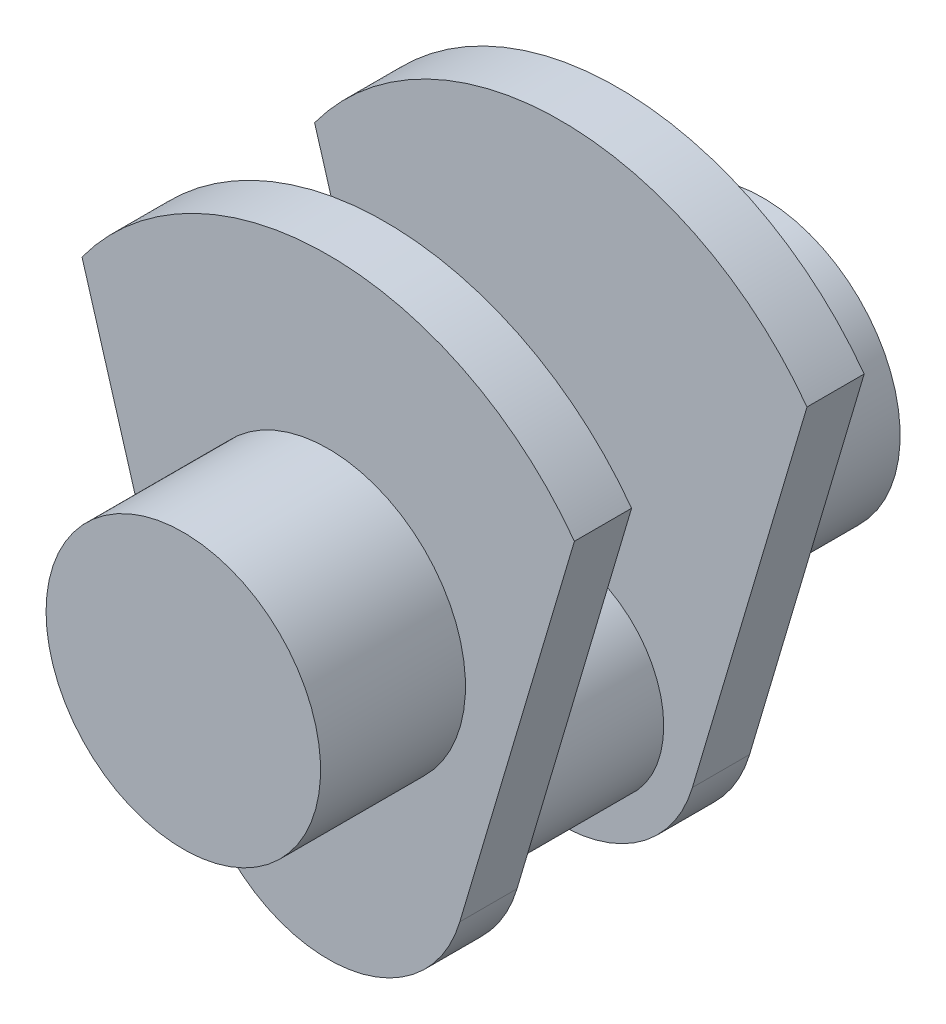
ISO-10303-21;
HEADER;
FILE_DESCRIPTION(('STEP AP214'),'2;1');
FILE_NAME('part.step','',(''),(''),'','','');
FILE_SCHEMA(('AUTOMOTIVE_DESIGN { 1 0 10303 214 1 1 1 1 }'));
ENDSEC;
DATA;
#1=APPLICATION_CONTEXT('core data for automotive mechanical design processes');
#2=APPLICATION_PROTOCOL_DEFINITION('international standard','automotive_design',2000,#1);
#3=PRODUCT_CONTEXT('',#1,'mechanical');
#4=PRODUCT('Part','Part','',(#3));
#5=PRODUCT_RELATED_PRODUCT_CATEGORY('part','',(#4));
#6=PRODUCT_DEFINITION_FORMATION('','',#4);
#7=PRODUCT_DEFINITION_CONTEXT('part definition',#1,'design');
#8=PRODUCT_DEFINITION('design','',#6,#7);
#9=PRODUCT_DEFINITION_SHAPE('','',#8);
#10=(LENGTH_UNIT() NAMED_UNIT(*) SI_UNIT(.MILLI.,.METRE.));
#11=(NAMED_UNIT(*) PLANE_ANGLE_UNIT() SI_UNIT($,.RADIAN.));
#12=(NAMED_UNIT(*) SI_UNIT($,.STERADIAN.) SOLID_ANGLE_UNIT());
#13=UNCERTAINTY_MEASURE_WITH_UNIT(LENGTH_MEASURE(1.E-05),#10,'distance_accuracy_value','');
#14=(GEOMETRIC_REPRESENTATION_CONTEXT(3) GLOBAL_UNCERTAINTY_ASSIGNED_CONTEXT((#13)) GLOBAL_UNIT_ASSIGNED_CONTEXT((#10,
#11,#12)) REPRESENTATION_CONTEXT('',''));
#15=CARTESIAN_POINT('',(0.,0.,0.));
#16=DIRECTION('',(0.,0.,1.));
#17=DIRECTION('',(1.,0.,0.));
#18=AXIS2_PLACEMENT_3D('',#15,#16,#17);
#19=CARTESIAN_POINT('',(0.,0.,15.));
#20=DIRECTION('',(0.,0.,-1.));
#21=DIRECTION('',(-1.,0.,0.));
#22=AXIS2_PLACEMENT_3D('',#19,#20,#21);
#23=CYLINDRICAL_SURFACE('',#22,80.);
#24=CARTESIAN_POINT('',(0.,0.,0.));
#25=DIRECTION('',(0.,0.,1.));
#26=DIRECTION('',(1.,0.,0.));
#27=AXIS2_PLACEMENT_3D('',#24,#25,#26);
#28=CIRCLE('',#27,80.);
#29=CARTESIAN_POINT('',(-64.5698934752721,47.2305923802784,0.));
#30=VERTEX_POINT('',#29);
#31=CARTESIAN_POINT('',(64.5698934752721,47.2305923802784,0.));
#32=VERTEX_POINT('',#31);
#33=EDGE_CURVE('E182',#30,#32,#28,.F.);
#34=ORIENTED_EDGE('',*,*,#33,.F.);
#35=DIRECTION('',(0.,0.,-1.));
#36=VECTOR('',#35,1.);
#37=CARTESIAN_POINT('',(-64.5698934752721,47.2305923802784,15.));
#38=LINE('',#37,#36);
#39=CARTESIAN_POINT('',(-64.5698934752721,47.2305923802784,15.));
#40=VERTEX_POINT('',#39);
#41=EDGE_CURVE('E44',#40,#30,#38,.T.);
#42=ORIENTED_EDGE('',*,*,#41,.F.);
#43=CARTESIAN_POINT('',(0.,0.,15.));
#44=DIRECTION('',(0.,0.,1.));
#45=DIRECTION('',(1.,0.,0.));
#46=AXIS2_PLACEMENT_3D('',#43,#44,#45);
#47=CIRCLE('',#46,80.);
#48=CARTESIAN_POINT('',(64.5698934752721,47.2305923802784,15.));
#49=VERTEX_POINT('',#48);
#50=EDGE_CURVE('E186',#40,#49,#47,.F.);
#51=ORIENTED_EDGE('',*,*,#50,.T.);
#52=DIRECTION('',(0.,0.,-1.));
#53=VECTOR('',#52,1.);
#54=CARTESIAN_POINT('',(64.5698934752721,47.2305923802784,15.));
#55=LINE('',#54,#53);
#56=EDGE_CURVE('E83',#49,#32,#55,.T.);
#57=ORIENTED_EDGE('',*,*,#56,.T.);
#58=EDGE_LOOP('',(#34,#42,#51,#57));
#59=FACE_BOUND('',#58,.T.);
#60=ADVANCED_FACE('F41',(#59),#23,.T.);
#61=CARTESIAN_POINT('',(-46.4995692255856,-13.7737999145419,15.));
#62=DIRECTION('',(-0.958819734868193,-0.284015344703924,0.));
#63=DIRECTION('',(0.284015344703924,-0.958819734868193,0.));
#64=AXIS2_PLACEMENT_3D('',#61,#62,#63);
#65=PLANE('',#64);
#66=DIRECTION('',(-0.284015344703924,0.958819734868193,0.));
#67=VECTOR('',#66,1.);
#68=CARTESIAN_POINT('',(-46.4995692255856,-13.7737999145419,0.));
#69=LINE('',#68,#67);
#70=CARTESIAN_POINT('',(-34.5175104552549,-54.2245524093412,0.));
#71=VERTEX_POINT('',#70);
#72=EDGE_CURVE('E202',#71,#30,#69,.T.);
#73=ORIENTED_EDGE('',*,*,#72,.F.);
#74=DIRECTION('',(0.,0.,-1.));
#75=VECTOR('',#74,1.);
#76=CARTESIAN_POINT('',(-34.5175104552549,-54.2245524093412,15.));
#77=LINE('',#76,#75);
#78=CARTESIAN_POINT('',(-34.5175104552549,-54.2245524093412,15.));
#79=VERTEX_POINT('',#78);
#80=EDGE_CURVE('E214',#79,#71,#77,.T.);
#81=ORIENTED_EDGE('',*,*,#80,.F.);
#82=DIRECTION('',(-0.284015344703924,0.958819734868193,0.));
#83=VECTOR('',#82,1.);
#84=CARTESIAN_POINT('',(-46.4995692255856,-13.7737999145419,15.));
#85=LINE('',#84,#83);
#86=EDGE_CURVE('E189',#79,#40,#85,.T.);
#87=ORIENTED_EDGE('',*,*,#86,.T.);
#88=ORIENTED_EDGE('',*,*,#41,.T.);
#89=EDGE_LOOP('',(#73,#81,#87,#88));
#90=FACE_BOUND('',#89,.T.);
#91=ADVANCED_FACE('F220',(#90),#65,.T.);
#92=CARTESIAN_POINT('',(0.,-44.,15.));
#93=DIRECTION('',(0.,0.,-1.));
#94=DIRECTION('',(-1.,0.,0.));
#95=AXIS2_PLACEMENT_3D('',#92,#93,#94);
#96=CYLINDRICAL_SURFACE('',#95,36.);
#97=CARTESIAN_POINT('',(0.,-44.,0.));
#98=DIRECTION('',(0.,0.,1.));
#99=DIRECTION('',(1.,0.,0.));
#100=AXIS2_PLACEMENT_3D('',#97,#98,#99);
#101=CIRCLE('',#100,36.);
#102=CARTESIAN_POINT('',(34.5175104552549,-54.2245524093412,0.));
#103=VERTEX_POINT('',#102);
#104=EDGE_CURVE('E76',#71,#103,#101,.T.);
#105=ORIENTED_EDGE('',*,*,#104,.T.);
#106=DIRECTION('',(0.,0.,-1.));
#107=VECTOR('',#106,1.);
#108=CARTESIAN_POINT('',(34.5175104552549,-54.2245524093412,15.));
#109=LINE('',#108,#107);
#110=CARTESIAN_POINT('',(34.5175104552549,-54.2245524093412,15.));
#111=VERTEX_POINT('',#110);
#112=EDGE_CURVE('E212',#111,#103,#109,.T.);
#113=ORIENTED_EDGE('',*,*,#112,.F.);
#114=CARTESIAN_POINT('',(0.,-44.,15.));
#115=DIRECTION('',(0.,0.,1.));
#116=DIRECTION('',(1.,0.,0.));
#117=AXIS2_PLACEMENT_3D('',#114,#115,#116);
#118=CIRCLE('',#117,36.);
#119=EDGE_CURVE('E194',#79,#111,#118,.T.);
#120=ORIENTED_EDGE('',*,*,#119,.F.);
#121=ORIENTED_EDGE('',*,*,#80,.T.);
#122=EDGE_LOOP('',(#105,#113,#120,#121));
#123=FACE_BOUND('',#122,.T.);
#124=ADVANCED_FACE('F227',(#123),#96,.T.);
#125=CARTESIAN_POINT('',(46.4995692255856,-13.7737999145419,15.));
#126=DIRECTION('',(-0.958819734868193,0.284015344703923,0.));
#127=DIRECTION('',(-0.284015344703923,-0.958819734868193,0.));
#128=AXIS2_PLACEMENT_3D('',#125,#126,#127);
#129=PLANE('',#128);
#130=DIRECTION('',(0.284015344703923,0.958819734868193,0.));
#131=VECTOR('',#130,1.);
#132=CARTESIAN_POINT('',(46.4995692255856,-13.7737999145419,0.));
#133=LINE('',#132,#131);
#134=EDGE_CURVE('E190',#103,#32,#133,.T.);
#135=ORIENTED_EDGE('',*,*,#134,.T.);
#136=ORIENTED_EDGE('',*,*,#56,.F.);
#137=DIRECTION('',(0.284015344703923,0.958819734868193,0.));
#138=VECTOR('',#137,1.);
#139=CARTESIAN_POINT('',(46.4995692255856,-13.7737999145419,15.));
#140=LINE('',#139,#138);
#141=EDGE_CURVE('E59',#111,#49,#140,.T.);
#142=ORIENTED_EDGE('',*,*,#141,.F.);
#143=ORIENTED_EDGE('',*,*,#112,.T.);
#144=EDGE_LOOP('',(#135,#136,#142,#143));
#145=FACE_BOUND('',#144,.T.);
#146=ADVANCED_FACE('F226',(#145),#129,.F.);
#147=CARTESIAN_POINT('',(0.,0.,15.));
#148=DIRECTION('',(0.,0.,1.));
#149=DIRECTION('',(1.,0.,0.));
#150=AXIS2_PLACEMENT_3D('',#147,#148,#149);
#151=PLANE('',#150);
#152=CARTESIAN_POINT('',(0.,-44.,15.));
#153=DIRECTION('',(0.,0.,1.));
#154=DIRECTION('',(1.,0.,0.));
#155=AXIS2_PLACEMENT_3D('',#152,#153,#154);
#156=CIRCLE('',#155,27.);
#157=CARTESIAN_POINT('',(27.,-44.,15.));
#158=VERTEX_POINT('',#157);
#159=EDGE_CURVE('E176',#158,#158,#156,.T.);
#160=ORIENTED_EDGE('',*,*,#159,.F.);
#161=EDGE_LOOP('',(#160));
#162=FACE_BOUND('',#161,.T.);
#163=ORIENTED_EDGE('',*,*,#50,.F.);
#164=ORIENTED_EDGE('',*,*,#86,.F.);
#165=ORIENTED_EDGE('',*,*,#119,.T.);
#166=ORIENTED_EDGE('',*,*,#141,.T.);
#167=EDGE_LOOP('',(#163,#164,#165,#166));
#168=FACE_BOUND('',#167,.T.);
#169=ADVANCED_FACE('F228',(#162,#168),#151,.T.);
#170=CARTESIAN_POINT('',(0.,0.,0.));
#171=DIRECTION('',(0.,0.,1.));
#172=DIRECTION('',(1.,0.,0.));
#173=AXIS2_PLACEMENT_3D('',#170,#171,#172);
#174=PLANE('',#173);
#175=CARTESIAN_POINT('',(0.,0.,0.));
#176=DIRECTION('',(0.,0.,-1.));
#177=DIRECTION('',(-1.,0.,0.));
#178=AXIS2_PLACEMENT_3D('',#175,#176,#177);
#179=CIRCLE('',#178,36.);
#180=CARTESIAN_POINT('',(-36.,0.,0.));
#181=VERTEX_POINT('',#180);
#182=EDGE_CURVE('E11',#181,#181,#179,.T.);
#183=ORIENTED_EDGE('',*,*,#182,.F.);
#184=EDGE_LOOP('',(#183));
#185=FACE_BOUND('',#184,.T.);
#186=ORIENTED_EDGE('',*,*,#33,.T.);
#187=ORIENTED_EDGE('',*,*,#134,.F.);
#188=ORIENTED_EDGE('',*,*,#104,.F.);
#189=ORIENTED_EDGE('',*,*,#72,.T.);
#190=EDGE_LOOP('',(#186,#187,#188,#189));
#191=FACE_BOUND('',#190,.T.);
#192=ADVANCED_FACE('F224',(#185,#191),#174,.F.);
#193=CARTESIAN_POINT('',(0.,-44.,61.));
#194=DIRECTION('',(0.,0.,-1.));
#195=DIRECTION('',(-1.,0.,0.));
#196=AXIS2_PLACEMENT_3D('',#193,#194,#195);
#197=CYLINDRICAL_SURFACE('',#196,27.);
#198=CARTESIAN_POINT('',(0.,-44.,61.));
#199=DIRECTION('',(0.,0.,1.));
#200=DIRECTION('',(1.,0.,0.));
#201=AXIS2_PLACEMENT_3D('',#198,#199,#200);
#202=CIRCLE('',#201,27.);
#203=CARTESIAN_POINT('',(27.,-44.,61.));
#204=VERTEX_POINT('',#203);
#205=EDGE_CURVE('E178',#204,#204,#202,.T.);
#206=ORIENTED_EDGE('',*,*,#205,.F.);
#207=EDGE_LOOP('',(#206));
#208=FACE_BOUND('',#207,.T.);
#209=ORIENTED_EDGE('',*,*,#159,.T.);
#210=EDGE_LOOP('',(#209));
#211=FACE_BOUND('',#210,.T.);
#212=ADVANCED_FACE('F236',(#208,#211),#197,.T.);
#213=CARTESIAN_POINT('',(0.,0.,-38.));
#214=DIRECTION('',(0.,0.,1.));
#215=DIRECTION('',(1.,0.,0.));
#216=AXIS2_PLACEMENT_3D('',#213,#214,#215);
#217=CYLINDRICAL_SURFACE('',#216,36.);
#218=CARTESIAN_POINT('',(0.,0.,-38.));
#219=DIRECTION('',(0.,0.,-1.));
#220=DIRECTION('',(-1.,0.,0.));
#221=AXIS2_PLACEMENT_3D('',#218,#219,#220);
#222=CIRCLE('',#221,36.);
#223=CARTESIAN_POINT('',(-36.,0.,-38.));
#224=VERTEX_POINT('',#223);
#225=EDGE_CURVE('E173',#224,#224,#222,.T.);
#226=ORIENTED_EDGE('',*,*,#225,.F.);
#227=EDGE_LOOP('',(#226));
#228=FACE_BOUND('',#227,.T.);
#229=ORIENTED_EDGE('',*,*,#182,.T.);
#230=EDGE_LOOP('',(#229));
#231=FACE_BOUND('',#230,.T.);
#232=ADVANCED_FACE('F283',(#228,#231),#217,.T.);
#233=CARTESIAN_POINT('',(0.,0.,-38.));
#234=DIRECTION('',(0.,0.,-1.));
#235=DIRECTION('',(-1.,0.,0.));
#236=AXIS2_PLACEMENT_3D('',#233,#234,#235);
#237=PLANE('',#236);
#238=ORIENTED_EDGE('',*,*,#225,.T.);
#239=EDGE_LOOP('',(#238));
#240=FACE_BOUND('',#239,.T.);
#241=ADVANCED_FACE('F292',(#240),#237,.T.);
#242=CARTESIAN_POINT('',(0.,0.,61.));
#243=DIRECTION('',(0.,0.,1.));
#244=DIRECTION('',(-1.,0.,0.));
#245=AXIS2_PLACEMENT_3D('',#242,#243,#244);
#246=CYLINDRICAL_SURFACE('',#245,80.);
#247=CARTESIAN_POINT('',(0.,0.,76.));
#248=DIRECTION('',(0.,0.,1.));
#249=DIRECTION('',(1.,0.,0.));
#250=AXIS2_PLACEMENT_3D('',#247,#248,#249);
#251=CIRCLE('',#250,80.);
#252=CARTESIAN_POINT('',(-64.5698934752721,47.2305923802784,76.));
#253=VERTEX_POINT('',#252);
#254=CARTESIAN_POINT('',(64.5698934752721,47.2305923802784,76.));
#255=VERTEX_POINT('',#254);
#256=EDGE_CURVE('E156',#253,#255,#251,.F.);
#257=ORIENTED_EDGE('',*,*,#256,.T.);
#258=DIRECTION('',(0.,0.,1.));
#259=VECTOR('',#258,1.);
#260=CARTESIAN_POINT('',(64.5698934752721,47.2305923802784,61.));
#261=LINE('',#260,#259);
#262=CARTESIAN_POINT('',(64.5698934752721,47.2305923802784,61.));
#263=VERTEX_POINT('',#262);
#264=EDGE_CURVE('E141',#263,#255,#261,.T.);
#265=ORIENTED_EDGE('',*,*,#264,.F.);
#266=CARTESIAN_POINT('',(0.,0.,61.));
#267=DIRECTION('',(0.,0.,1.));
#268=DIRECTION('',(1.,0.,0.));
#269=AXIS2_PLACEMENT_3D('',#266,#267,#268);
#270=CIRCLE('',#269,80.);
#271=CARTESIAN_POINT('',(-64.5698934752721,47.2305923802784,61.));
#272=VERTEX_POINT('',#271);
#273=EDGE_CURVE('E118',#272,#263,#270,.F.);
#274=ORIENTED_EDGE('',*,*,#273,.F.);
#275=DIRECTION('',(0.,0.,1.));
#276=VECTOR('',#275,1.);
#277=CARTESIAN_POINT('',(-64.5698934752721,47.2305923802784,61.));
#278=LINE('',#277,#276);
#279=EDGE_CURVE('E128',#272,#253,#278,.T.);
#280=ORIENTED_EDGE('',*,*,#279,.T.);
#281=EDGE_LOOP('',(#257,#265,#274,#280));
#282=FACE_BOUND('',#281,.T.);
#283=ADVANCED_FACE('F139',(#282),#246,.T.);
#284=CARTESIAN_POINT('',(-46.4995692255856,-13.7737999145419,61.));
#285=DIRECTION('',(-0.958819734868193,-0.284015344703924,0.));
#286=DIRECTION('',(0.284015344703924,-0.958819734868193,0.));
#287=AXIS2_PLACEMENT_3D('',#284,#285,#286);
#288=PLANE('',#287);
#289=DIRECTION('',(-0.284015344703924,0.958819734868193,0.));
#290=VECTOR('',#289,1.);
#291=CARTESIAN_POINT('',(-46.4995692255856,-13.7737999145419,76.));
#292=LINE('',#291,#290);
#293=CARTESIAN_POINT('',(-34.5175104552549,-54.2245524093412,76.));
#294=VERTEX_POINT('',#293);
#295=EDGE_CURVE('E131',#294,#253,#292,.T.);
#296=ORIENTED_EDGE('',*,*,#295,.T.);
#297=ORIENTED_EDGE('',*,*,#279,.F.);
#298=DIRECTION('',(-0.284015344703924,0.958819734868193,0.));
#299=VECTOR('',#298,1.);
#300=CARTESIAN_POINT('',(-46.4995692255856,-13.7737999145419,61.));
#301=LINE('',#300,#299);
#302=CARTESIAN_POINT('',(-34.5175104552549,-54.2245524093412,61.));
#303=VERTEX_POINT('',#302);
#304=EDGE_CURVE('E114',#303,#272,#301,.T.);
#305=ORIENTED_EDGE('',*,*,#304,.F.);
#306=DIRECTION('',(0.,0.,1.));
#307=VECTOR('',#306,1.);
#308=CARTESIAN_POINT('',(-34.5175104552549,-54.2245524093412,61.));
#309=LINE('',#308,#307);
#310=EDGE_CURVE('E137',#303,#294,#309,.T.);
#311=ORIENTED_EDGE('',*,*,#310,.T.);
#312=EDGE_LOOP('',(#296,#297,#305,#311));
#313=FACE_BOUND('',#312,.T.);
#314=ADVANCED_FACE('F129',(#313),#288,.T.);
#315=CARTESIAN_POINT('',(0.,-44.,61.));
#316=DIRECTION('',(0.,0.,1.));
#317=DIRECTION('',(-1.,0.,0.));
#318=AXIS2_PLACEMENT_3D('',#315,#316,#317);
#319=CYLINDRICAL_SURFACE('',#318,36.);
#320=CARTESIAN_POINT('',(0.,-44.,76.));
#321=DIRECTION('',(0.,0.,1.));
#322=DIRECTION('',(1.,0.,0.));
#323=AXIS2_PLACEMENT_3D('',#320,#321,#322);
#324=CIRCLE('',#323,36.);
#325=CARTESIAN_POINT('',(34.5175104552549,-54.2245524093412,76.));
#326=VERTEX_POINT('',#325);
#327=EDGE_CURVE('E146',#294,#326,#324,.T.);
#328=ORIENTED_EDGE('',*,*,#327,.F.);
#329=ORIENTED_EDGE('',*,*,#310,.F.);
#330=CARTESIAN_POINT('',(0.,-44.,61.));
#331=DIRECTION('',(0.,0.,1.));
#332=DIRECTION('',(1.,0.,0.));
#333=AXIS2_PLACEMENT_3D('',#330,#331,#332);
#334=CIRCLE('',#333,36.);
#335=CARTESIAN_POINT('',(34.5175104552549,-54.2245524093412,61.));
#336=VERTEX_POINT('',#335);
#337=EDGE_CURVE('E121',#303,#336,#334,.T.);
#338=ORIENTED_EDGE('',*,*,#337,.T.);
#339=DIRECTION('',(0.,0.,1.));
#340=VECTOR('',#339,1.);
#341=CARTESIAN_POINT('',(34.5175104552549,-54.2245524093412,61.));
#342=LINE('',#341,#340);
#343=EDGE_CURVE('E167',#336,#326,#342,.T.);
#344=ORIENTED_EDGE('',*,*,#343,.T.);
#345=EDGE_LOOP('',(#328,#329,#338,#344));
#346=FACE_BOUND('',#345,.T.);
#347=ADVANCED_FACE('F318',(#346),#319,.T.);
#348=CARTESIAN_POINT('',(46.4995692255856,-13.7737999145419,61.));
#349=DIRECTION('',(-0.958819734868193,0.284015344703923,0.));
#350=DIRECTION('',(-0.284015344703923,-0.958819734868193,0.));
#351=AXIS2_PLACEMENT_3D('',#348,#349,#350);
#352=PLANE('',#351);
#353=DIRECTION('',(0.284015344703923,0.958819734868193,0.));
#354=VECTOR('',#353,1.);
#355=CARTESIAN_POINT('',(46.4995692255856,-13.7737999145419,76.));
#356=LINE('',#355,#354);
#357=EDGE_CURVE('E143',#326,#255,#356,.T.);
#358=ORIENTED_EDGE('',*,*,#357,.F.);
#359=ORIENTED_EDGE('',*,*,#343,.F.);
#360=DIRECTION('',(0.284015344703923,0.958819734868193,0.));
#361=VECTOR('',#360,1.);
#362=CARTESIAN_POINT('',(46.4995692255856,-13.7737999145419,61.));
#363=LINE('',#362,#361);
#364=EDGE_CURVE('E153',#336,#263,#363,.T.);
#365=ORIENTED_EDGE('',*,*,#364,.T.);
#366=ORIENTED_EDGE('',*,*,#264,.T.);
#367=EDGE_LOOP('',(#358,#359,#365,#366));
#368=FACE_BOUND('',#367,.T.);
#369=ADVANCED_FACE('F326',(#368),#352,.F.);
#370=CARTESIAN_POINT('',(0.,0.,61.));
#371=DIRECTION('',(0.,0.,-1.));
#372=DIRECTION('',(1.,0.,0.));
#373=AXIS2_PLACEMENT_3D('',#370,#371,#372);
#374=PLANE('',#373);
#375=ORIENTED_EDGE('',*,*,#205,.T.);
#376=EDGE_LOOP('',(#375));
#377=FACE_BOUND('',#376,.T.);
#378=ORIENTED_EDGE('',*,*,#273,.T.);
#379=ORIENTED_EDGE('',*,*,#364,.F.);
#380=ORIENTED_EDGE('',*,*,#337,.F.);
#381=ORIENTED_EDGE('',*,*,#304,.T.);
#382=EDGE_LOOP('',(#378,#379,#380,#381));
#383=FACE_BOUND('',#382,.T.);
#384=ADVANCED_FACE('F116',(#377,#383),#374,.T.);
#385=CARTESIAN_POINT('',(0.,0.,76.));
#386=DIRECTION('',(0.,0.,-1.));
#387=DIRECTION('',(1.,0.,0.));
#388=AXIS2_PLACEMENT_3D('',#385,#386,#387);
#389=PLANE('',#388);
#390=CARTESIAN_POINT('',(0.,0.,76.));
#391=DIRECTION('',(0.,0.,-1.));
#392=DIRECTION('',(-1.,0.,0.));
#393=AXIS2_PLACEMENT_3D('',#390,#391,#392);
#394=CIRCLE('',#393,36.);
#395=CARTESIAN_POINT('',(-36.,0.,76.));
#396=VERTEX_POINT('',#395);
#397=EDGE_CURVE('E136',#396,#396,#394,.T.);
#398=ORIENTED_EDGE('',*,*,#397,.T.);
#399=EDGE_LOOP('',(#398));
#400=FACE_BOUND('',#399,.T.);
#401=ORIENTED_EDGE('',*,*,#256,.F.);
#402=ORIENTED_EDGE('',*,*,#295,.F.);
#403=ORIENTED_EDGE('',*,*,#327,.T.);
#404=ORIENTED_EDGE('',*,*,#357,.T.);
#405=EDGE_LOOP('',(#401,#402,#403,#404));
#406=FACE_BOUND('',#405,.T.);
#407=ADVANCED_FACE('F343',(#400,#406),#389,.F.);
#408=CARTESIAN_POINT('',(0.,0.,114.));
#409=DIRECTION('',(0.,0.,-1.));
#410=DIRECTION('',(1.,0.,0.));
#411=AXIS2_PLACEMENT_3D('',#408,#409,#410);
#412=CYLINDRICAL_SURFACE('',#411,36.);
#413=CARTESIAN_POINT('',(0.,0.,114.));
#414=DIRECTION('',(0.,0.,-1.));
#415=DIRECTION('',(-1.,0.,0.));
#416=AXIS2_PLACEMENT_3D('',#413,#414,#415);
#417=CIRCLE('',#416,36.);
#418=CARTESIAN_POINT('',(-36.,0.,114.));
#419=VERTEX_POINT('',#418);
#420=EDGE_CURVE('E159',#419,#419,#417,.T.);
#421=ORIENTED_EDGE('',*,*,#420,.T.);
#422=EDGE_LOOP('',(#421));
#423=FACE_BOUND('',#422,.T.);
#424=ORIENTED_EDGE('',*,*,#397,.F.);
#425=EDGE_LOOP('',(#424));
#426=FACE_BOUND('',#425,.T.);
#427=ADVANCED_FACE('F355',(#423,#426),#412,.T.);
#428=CARTESIAN_POINT('',(0.,0.,114.));
#429=DIRECTION('',(0.,0.,1.));
#430=DIRECTION('',(-1.,0.,0.));
#431=AXIS2_PLACEMENT_3D('',#428,#429,#430);
#432=PLANE('',#431);
#433=ORIENTED_EDGE('',*,*,#420,.F.);
#434=EDGE_LOOP('',(#433));
#435=FACE_BOUND('',#434,.T.);
#436=ADVANCED_FACE('F367',(#435),#432,.T.);
#437=CLOSED_SHELL('',(#60,#91,#124,#146,#169,#192,#212,#232,#241,#283,#314,#347,#369,#384,#407,
#427,#436));
#438=MANIFOLD_SOLID_BREP('B2',#437);
#439=ADVANCED_BREP_SHAPE_REPRESENTATION('',(#18,#438),#14);
#440=SHAPE_DEFINITION_REPRESENTATION(#9,#439);
ENDSEC;
END-ISO-10303-21;
